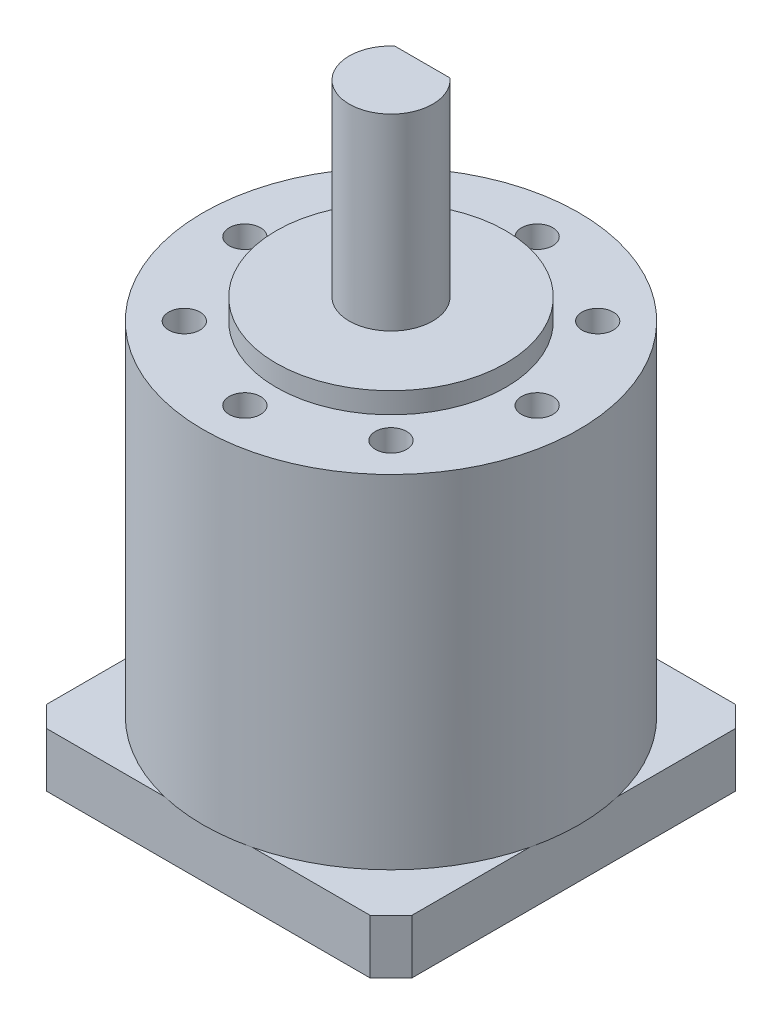
ISO-10303-21;
HEADER;
FILE_DESCRIPTION(('STEP AP214'),'2;1');
FILE_NAME('part.step','',(''),(''),'','','');
FILE_SCHEMA(('AUTOMOTIVE_DESIGN { 1 0 10303 214 1 1 1 1 }'));
ENDSEC;
DATA;
#1=APPLICATION_CONTEXT('core data for automotive mechanical design processes');
#2=APPLICATION_PROTOCOL_DEFINITION('international standard','automotive_design',2000,#1);
#3=PRODUCT_CONTEXT('',#1,'mechanical');
#4=PRODUCT('Part','Part','',(#3));
#5=PRODUCT_RELATED_PRODUCT_CATEGORY('part','',(#4));
#6=PRODUCT_DEFINITION_FORMATION('','',#4);
#7=PRODUCT_DEFINITION_CONTEXT('part definition',#1,'design');
#8=PRODUCT_DEFINITION('design','',#6,#7);
#9=PRODUCT_DEFINITION_SHAPE('','',#8);
#10=(LENGTH_UNIT() NAMED_UNIT(*) SI_UNIT(.MILLI.,.METRE.));
#11=(NAMED_UNIT(*) PLANE_ANGLE_UNIT() SI_UNIT($,.RADIAN.));
#12=(NAMED_UNIT(*) SI_UNIT($,.STERADIAN.) SOLID_ANGLE_UNIT());
#13=UNCERTAINTY_MEASURE_WITH_UNIT(LENGTH_MEASURE(1.E-05),#10,'distance_accuracy_value','');
#14=(GEOMETRIC_REPRESENTATION_CONTEXT(3) GLOBAL_UNCERTAINTY_ASSIGNED_CONTEXT((#13)) GLOBAL_UNIT_ASSIGNED_CONTEXT((#10,
#11,#12)) REPRESENTATION_CONTEXT('',''));
#15=CARTESIAN_POINT('',(0.,0.,0.));
#16=DIRECTION('',(0.,0.,1.));
#17=DIRECTION('',(1.,0.,0.));
#18=AXIS2_PLACEMENT_3D('',#15,#16,#17);
#19=CARTESIAN_POINT('',(0.,5.2,0.));
#20=DIRECTION('',(0.,1.,0.));
#21=DIRECTION('',(0.,0.,1.));
#22=AXIS2_PLACEMENT_3D('',#19,#20,#21);
#23=PLANE('',#22);
#24=DIRECTION('',(1.,0.,0.));
#25=VECTOR('',#24,1.);
#26=CARTESIAN_POINT('',(-17.5,5.2,17.5));
#27=LINE('',#26,#25);
#28=CARTESIAN_POINT('',(4.21307488658817,5.2,17.5));
#29=VERTEX_POINT('',#28);
#30=CARTESIAN_POINT('',(15.5,5.2,17.5));
#31=VERTEX_POINT('',#30);
#32=EDGE_CURVE('E204',#29,#31,#27,.T.);
#33=ORIENTED_EDGE('',*,*,#32,.T.);
#34=DIRECTION('',(-0.707106781186548,0.,0.707106781186547));
#35=VECTOR('',#34,1.);
#36=CARTESIAN_POINT('',(16.5,5.2,16.5));
#37=LINE('',#36,#35);
#38=CARTESIAN_POINT('',(17.5,5.2,15.5));
#39=VERTEX_POINT('',#38);
#40=EDGE_CURVE('E243',#31,#39,#37,.F.);
#41=ORIENTED_EDGE('',*,*,#40,.T.);
#42=DIRECTION('',(0.,0.,-1.));
#43=VECTOR('',#42,1.);
#44=CARTESIAN_POINT('',(17.5,5.2,-17.5));
#45=LINE('',#44,#43);
#46=CARTESIAN_POINT('',(17.5,5.2,4.21307488658818));
#47=VERTEX_POINT('',#46);
#48=EDGE_CURVE('E193',#39,#47,#45,.T.);
#49=ORIENTED_EDGE('',*,*,#48,.T.);
#50=CARTESIAN_POINT('',(0.,5.2,0.));
#51=DIRECTION('',(0.,1.,0.));
#52=DIRECTION('',(0.,0.,1.));
#53=AXIS2_PLACEMENT_3D('',#50,#51,#52);
#54=CIRCLE('',#53,18.);
#55=EDGE_CURVE('E190',#29,#47,#54,.T.);
#56=ORIENTED_EDGE('',*,*,#55,.F.);
#57=EDGE_LOOP('',(#33,#41,#49,#56));
#58=FACE_BOUND('',#57,.T.);
#59=ADVANCED_FACE('F50',(#58),#23,.T.);
#60=CARTESIAN_POINT('',(17.5,5.2,-4.21307488658819));
#61=VERTEX_POINT('',#60);
#62=CARTESIAN_POINT('',(17.5,5.2,-15.5));
#63=VERTEX_POINT('',#62);
#64=EDGE_CURVE('E197',#61,#63,#45,.T.);
#65=ORIENTED_EDGE('',*,*,#64,.T.);
#66=DIRECTION('',(0.707106781186546,0.,0.707106781186549));
#67=VECTOR('',#66,1.);
#68=CARTESIAN_POINT('',(16.5,5.2,-16.5));
#69=LINE('',#68,#67);
#70=CARTESIAN_POINT('',(15.5,5.2,-17.5));
#71=VERTEX_POINT('',#70);
#72=EDGE_CURVE('E236',#63,#71,#69,.F.);
#73=ORIENTED_EDGE('',*,*,#72,.T.);
#74=DIRECTION('',(-1.,0.,0.));
#75=VECTOR('',#74,1.);
#76=CARTESIAN_POINT('',(-17.5,5.2,-17.5));
#77=LINE('',#76,#75);
#78=CARTESIAN_POINT('',(4.21307488658817,5.2,-17.5));
#79=VERTEX_POINT('',#78);
#80=EDGE_CURVE('E196',#71,#79,#77,.T.);
#81=ORIENTED_EDGE('',*,*,#80,.T.);
#82=EDGE_CURVE('E181',#61,#79,#54,.T.);
#83=ORIENTED_EDGE('',*,*,#82,.F.);
#84=EDGE_LOOP('',(#65,#73,#81,#83));
#85=FACE_BOUND('',#84,.T.);
#86=ADVANCED_FACE('F332',(#85),#23,.T.);
#87=CARTESIAN_POINT('',(-4.21307488658817,5.2,-17.5));
#88=VERTEX_POINT('',#87);
#89=CARTESIAN_POINT('',(-15.5,5.2,-17.5));
#90=VERTEX_POINT('',#89);
#91=EDGE_CURVE('E194',#88,#90,#77,.T.);
#92=ORIENTED_EDGE('',*,*,#91,.T.);
#93=DIRECTION('',(0.707106781186548,0.,-0.707106781186548));
#94=VECTOR('',#93,1.);
#95=CARTESIAN_POINT('',(-16.5,5.2,-16.5));
#96=LINE('',#95,#94);
#97=CARTESIAN_POINT('',(-17.5,5.2,-15.5));
#98=VERTEX_POINT('',#97);
#99=EDGE_CURVE('E11',#90,#98,#96,.F.);
#100=ORIENTED_EDGE('',*,*,#99,.T.);
#101=DIRECTION('',(0.,0.,1.));
#102=VECTOR('',#101,1.);
#103=CARTESIAN_POINT('',(-17.5,5.2,-17.5));
#104=LINE('',#103,#102);
#105=CARTESIAN_POINT('',(-17.5,5.2,-4.21307488658815));
#106=VERTEX_POINT('',#105);
#107=EDGE_CURVE('E205',#98,#106,#104,.T.);
#108=ORIENTED_EDGE('',*,*,#107,.T.);
#109=EDGE_CURVE('E311',#88,#106,#54,.T.);
#110=ORIENTED_EDGE('',*,*,#109,.F.);
#111=EDGE_LOOP('',(#92,#100,#108,#110));
#112=FACE_BOUND('',#111,.T.);
#113=ADVANCED_FACE('F314',(#112),#23,.T.);
#114=CARTESIAN_POINT('',(17.5,5.2,-17.5));
#115=DIRECTION('',(-1.,0.,0.));
#116=DIRECTION('',(0.,0.,1.));
#117=AXIS2_PLACEMENT_3D('',#114,#115,#116);
#118=PLANE('',#117);
#119=DIRECTION('',(0.,0.,-1.));
#120=VECTOR('',#119,1.);
#121=CARTESIAN_POINT('',(17.5,0.,-17.5));
#122=LINE('',#121,#120);
#123=CARTESIAN_POINT('',(17.5,0.,15.5));
#124=VERTEX_POINT('',#123);
#125=CARTESIAN_POINT('',(17.5,0.,-15.5));
#126=VERTEX_POINT('',#125);
#127=EDGE_CURVE('E189',#124,#126,#122,.T.);
#128=ORIENTED_EDGE('',*,*,#127,.T.);
#129=DIRECTION('',(0.,1.,0.));
#130=VECTOR('',#129,1.);
#131=CARTESIAN_POINT('',(17.5,5.2,-15.5));
#132=LINE('',#131,#130);
#133=EDGE_CURVE('E237',#126,#63,#132,.T.);
#134=ORIENTED_EDGE('',*,*,#133,.T.);
#135=ORIENTED_EDGE('',*,*,#64,.F.);
#136=EDGE_CURVE('E198',#47,#61,#45,.T.);
#137=ORIENTED_EDGE('',*,*,#136,.F.);
#138=ORIENTED_EDGE('',*,*,#48,.F.);
#139=DIRECTION('',(0.,-1.,0.));
#140=VECTOR('',#139,1.);
#141=CARTESIAN_POINT('',(17.5,5.2,15.5));
#142=LINE('',#141,#140);
#143=EDGE_CURVE('E233',#39,#124,#142,.T.);
#144=ORIENTED_EDGE('',*,*,#143,.T.);
#145=EDGE_LOOP('',(#128,#134,#135,#137,#138,#144));
#146=FACE_BOUND('',#145,.T.);
#147=ADVANCED_FACE('F283',(#146),#118,.F.);
#148=CARTESIAN_POINT('',(-17.5,5.2,-17.5));
#149=DIRECTION('',(0.,0.,1.));
#150=DIRECTION('',(1.,0.,0.));
#151=AXIS2_PLACEMENT_3D('',#148,#149,#150);
#152=PLANE('',#151);
#153=ORIENTED_EDGE('',*,*,#80,.F.);
#154=DIRECTION('',(0.,-1.,0.));
#155=VECTOR('',#154,1.);
#156=CARTESIAN_POINT('',(15.5,5.2,-17.5));
#157=LINE('',#156,#155);
#158=CARTESIAN_POINT('',(15.5,0.,-17.5));
#159=VERTEX_POINT('',#158);
#160=EDGE_CURVE('E225',#71,#159,#157,.T.);
#161=ORIENTED_EDGE('',*,*,#160,.T.);
#162=DIRECTION('',(-1.,0.,0.));
#163=VECTOR('',#162,1.);
#164=CARTESIAN_POINT('',(-17.5,0.,-17.5));
#165=LINE('',#164,#163);
#166=CARTESIAN_POINT('',(-15.5,0.,-17.5));
#167=VERTEX_POINT('',#166);
#168=EDGE_CURVE('E211',#159,#167,#165,.T.);
#169=ORIENTED_EDGE('',*,*,#168,.T.);
#170=DIRECTION('',(0.,1.,0.));
#171=VECTOR('',#170,1.);
#172=CARTESIAN_POINT('',(-15.5,5.2,-17.5));
#173=LINE('',#172,#171);
#174=EDGE_CURVE('E219',#167,#90,#173,.T.);
#175=ORIENTED_EDGE('',*,*,#174,.T.);
#176=ORIENTED_EDGE('',*,*,#91,.F.);
#177=EDGE_CURVE('E203',#79,#88,#77,.T.);
#178=ORIENTED_EDGE('',*,*,#177,.F.);
#179=EDGE_LOOP('',(#153,#161,#169,#175,#176,#178));
#180=FACE_BOUND('',#179,.T.);
#181=ADVANCED_FACE('F274',(#180),#152,.F.);
#182=CARTESIAN_POINT('',(-17.5,5.2,-17.5));
#183=DIRECTION('',(1.,0.,0.));
#184=DIRECTION('',(0.,0.,-1.));
#185=AXIS2_PLACEMENT_3D('',#182,#183,#184);
#186=PLANE('',#185);
#187=DIRECTION('',(0.,0.,1.));
#188=VECTOR('',#187,1.);
#189=CARTESIAN_POINT('',(-17.5,0.,-17.5));
#190=LINE('',#189,#188);
#191=CARTESIAN_POINT('',(-17.5,0.,-15.5));
#192=VERTEX_POINT('',#191);
#193=CARTESIAN_POINT('',(-17.5,0.,15.5));
#194=VERTEX_POINT('',#193);
#195=EDGE_CURVE('E212',#192,#194,#190,.T.);
#196=ORIENTED_EDGE('',*,*,#195,.T.);
#197=DIRECTION('',(0.,1.,0.));
#198=VECTOR('',#197,1.);
#199=CARTESIAN_POINT('',(-17.5,5.2,15.5));
#200=LINE('',#199,#198);
#201=CARTESIAN_POINT('',(-17.5,5.2,15.5));
#202=VERTEX_POINT('',#201);
#203=EDGE_CURVE('E67',#194,#202,#200,.T.);
#204=ORIENTED_EDGE('',*,*,#203,.T.);
#205=CARTESIAN_POINT('',(-17.5,5.2,4.21307488658816));
#206=VERTEX_POINT('',#205);
#207=EDGE_CURVE('E199',#206,#202,#104,.T.);
#208=ORIENTED_EDGE('',*,*,#207,.F.);
#209=EDGE_CURVE('E202',#106,#206,#104,.T.);
#210=ORIENTED_EDGE('',*,*,#209,.F.);
#211=ORIENTED_EDGE('',*,*,#107,.F.);
#212=DIRECTION('',(0.,-1.,0.));
#213=VECTOR('',#212,1.);
#214=CARTESIAN_POINT('',(-17.5,5.2,-15.5));
#215=LINE('',#214,#213);
#216=EDGE_CURVE('E250',#98,#192,#215,.T.);
#217=ORIENTED_EDGE('',*,*,#216,.T.);
#218=EDGE_LOOP('',(#196,#204,#208,#210,#211,#217));
#219=FACE_BOUND('',#218,.T.);
#220=ADVANCED_FACE('F268',(#219),#186,.F.);
#221=CARTESIAN_POINT('',(-17.5,5.2,17.5));
#222=DIRECTION('',(0.,0.,-1.));
#223=DIRECTION('',(-1.,0.,0.));
#224=AXIS2_PLACEMENT_3D('',#221,#222,#223);
#225=PLANE('',#224);
#226=DIRECTION('',(1.,0.,0.));
#227=VECTOR('',#226,1.);
#228=CARTESIAN_POINT('',(-17.5,0.,17.5));
#229=LINE('',#228,#227);
#230=CARTESIAN_POINT('',(-15.5,0.,17.5));
#231=VERTEX_POINT('',#230);
#232=CARTESIAN_POINT('',(15.5,0.,17.5));
#233=VERTEX_POINT('',#232);
#234=EDGE_CURVE('E216',#231,#233,#229,.T.);
#235=ORIENTED_EDGE('',*,*,#234,.T.);
#236=DIRECTION('',(0.,1.,0.));
#237=VECTOR('',#236,1.);
#238=CARTESIAN_POINT('',(15.5,5.2,17.5));
#239=LINE('',#238,#237);
#240=EDGE_CURVE('E245',#233,#31,#239,.T.);
#241=ORIENTED_EDGE('',*,*,#240,.T.);
#242=ORIENTED_EDGE('',*,*,#32,.F.);
#243=CARTESIAN_POINT('',(-4.21307488658817,5.2,17.5));
#244=VERTEX_POINT('',#243);
#245=EDGE_CURVE('E208',#244,#29,#27,.T.);
#246=ORIENTED_EDGE('',*,*,#245,.F.);
#247=CARTESIAN_POINT('',(-15.5,5.2,17.5));
#248=VERTEX_POINT('',#247);
#249=EDGE_CURVE('E206',#248,#244,#27,.T.);
#250=ORIENTED_EDGE('',*,*,#249,.F.);
#251=DIRECTION('',(0.,-1.,0.));
#252=VECTOR('',#251,1.);
#253=CARTESIAN_POINT('',(-15.5,5.2,17.5));
#254=LINE('',#253,#252);
#255=EDGE_CURVE('E238',#248,#231,#254,.T.);
#256=ORIENTED_EDGE('',*,*,#255,.T.);
#257=EDGE_LOOP('',(#235,#241,#242,#246,#250,#256));
#258=FACE_BOUND('',#257,.T.);
#259=ADVANCED_FACE('F256',(#258),#225,.F.);
#260=ORIENTED_EDGE('',*,*,#207,.T.);
#261=DIRECTION('',(-0.707106781186548,0.,-0.707106781186548));
#262=VECTOR('',#261,1.);
#263=CARTESIAN_POINT('',(-16.5,5.2,16.5));
#264=LINE('',#263,#262);
#265=EDGE_CURVE('E57',#202,#248,#264,.F.);
#266=ORIENTED_EDGE('',*,*,#265,.T.);
#267=ORIENTED_EDGE('',*,*,#249,.T.);
#268=EDGE_CURVE('E195',#206,#244,#54,.T.);
#269=ORIENTED_EDGE('',*,*,#268,.F.);
#270=EDGE_LOOP('',(#260,#266,#267,#269));
#271=FACE_BOUND('',#270,.T.);
#272=ADVANCED_FACE('F251',(#271),#23,.T.);
#273=CARTESIAN_POINT('',(0.,0.,0.));
#274=DIRECTION('',(0.,1.,0.));
#275=DIRECTION('',(0.,0.,1.));
#276=AXIS2_PLACEMENT_3D('',#273,#274,#275);
#277=PLANE('',#276);
#278=ORIENTED_EDGE('',*,*,#168,.F.);
#279=DIRECTION('',(-0.707106781186546,0.,-0.707106781186549));
#280=VECTOR('',#279,1.);
#281=CARTESIAN_POINT('',(15.5,0.,-17.5));
#282=LINE('',#281,#280);
#283=EDGE_CURVE('E231',#159,#126,#282,.F.);
#284=ORIENTED_EDGE('',*,*,#283,.T.);
#285=ORIENTED_EDGE('',*,*,#127,.F.);
#286=DIRECTION('',(0.707106781186548,0.,-0.707106781186547));
#287=VECTOR('',#286,1.);
#288=CARTESIAN_POINT('',(17.5,0.,15.5));
#289=LINE('',#288,#287);
#290=EDGE_CURVE('E226',#124,#233,#289,.F.);
#291=ORIENTED_EDGE('',*,*,#290,.T.);
#292=ORIENTED_EDGE('',*,*,#234,.F.);
#293=DIRECTION('',(0.707106781186548,0.,0.707106781186548));
#294=VECTOR('',#293,1.);
#295=CARTESIAN_POINT('',(-15.5,0.,17.5));
#296=LINE('',#295,#294);
#297=EDGE_CURVE('E229',#231,#194,#296,.F.);
#298=ORIENTED_EDGE('',*,*,#297,.T.);
#299=ORIENTED_EDGE('',*,*,#195,.F.);
#300=DIRECTION('',(-0.707106781186548,0.,0.707106781186548));
#301=VECTOR('',#300,1.);
#302=CARTESIAN_POINT('',(-17.5,0.,-15.5));
#303=LINE('',#302,#301);
#304=EDGE_CURVE('E223',#192,#167,#303,.F.);
#305=ORIENTED_EDGE('',*,*,#304,.T.);
#306=EDGE_LOOP('',(#278,#284,#285,#291,#292,#298,#299,#305));
#307=FACE_BOUND('',#306,.T.);
#308=ADVANCED_FACE('F270',(#307),#277,.F.);
#309=CARTESIAN_POINT('',(0.,5.2,0.));
#310=DIRECTION('',(0.,1.,0.));
#311=DIRECTION('',(0.,0.,1.));
#312=AXIS2_PLACEMENT_3D('',#309,#310,#311);
#313=PLANE('',#312);
#314=EDGE_CURVE('E191',#47,#61,#54,.T.);
#315=ORIENTED_EDGE('',*,*,#314,.F.);
#316=ORIENTED_EDGE('',*,*,#136,.T.);
#317=EDGE_LOOP('',(#315,#316));
#318=FACE_BOUND('',#317,.T.);
#319=ADVANCED_FACE('F319',(#318),#313,.F.);
#320=EDGE_CURVE('E308',#79,#88,#54,.T.);
#321=ORIENTED_EDGE('',*,*,#320,.F.);
#322=ORIENTED_EDGE('',*,*,#177,.T.);
#323=EDGE_LOOP('',(#321,#322));
#324=FACE_BOUND('',#323,.T.);
#325=ADVANCED_FACE('F320',(#324),#313,.F.);
#326=EDGE_CURVE('E304',#106,#206,#54,.T.);
#327=ORIENTED_EDGE('',*,*,#326,.F.);
#328=ORIENTED_EDGE('',*,*,#209,.T.);
#329=EDGE_LOOP('',(#327,#328));
#330=FACE_BOUND('',#329,.T.);
#331=ADVANCED_FACE('F317',(#330),#313,.F.);
#332=EDGE_CURVE('E171',#244,#29,#54,.T.);
#333=ORIENTED_EDGE('',*,*,#332,.F.);
#334=ORIENTED_EDGE('',*,*,#245,.T.);
#335=EDGE_LOOP('',(#333,#334));
#336=FACE_BOUND('',#335,.T.);
#337=ADVANCED_FACE('F296',(#336),#313,.F.);
#338=CARTESIAN_POINT('',(0.,38.,0.));
#339=DIRECTION('',(0.,-1.,0.));
#340=DIRECTION('',(0.,0.,-1.));
#341=AXIS2_PLACEMENT_3D('',#338,#339,#340);
#342=CYLINDRICAL_SURFACE('',#341,18.);
#343=CARTESIAN_POINT('',(0.,38.,0.));
#344=DIRECTION('',(0.,1.,0.));
#345=DIRECTION('',(0.,0.,1.));
#346=AXIS2_PLACEMENT_3D('',#343,#344,#345);
#347=CIRCLE('',#346,18.);
#348=CARTESIAN_POINT('',(0.,38.,18.));
#349=VERTEX_POINT('',#348);
#350=EDGE_CURVE('E184',#349,#349,#347,.T.);
#351=ORIENTED_EDGE('',*,*,#350,.F.);
#352=EDGE_LOOP('',(#351));
#353=FACE_BOUND('',#352,.T.);
#354=ORIENTED_EDGE('',*,*,#55,.T.);
#355=ORIENTED_EDGE('',*,*,#314,.T.);
#356=ORIENTED_EDGE('',*,*,#82,.T.);
#357=ORIENTED_EDGE('',*,*,#320,.T.);
#358=ORIENTED_EDGE('',*,*,#109,.T.);
#359=ORIENTED_EDGE('',*,*,#326,.T.);
#360=ORIENTED_EDGE('',*,*,#268,.T.);
#361=ORIENTED_EDGE('',*,*,#332,.T.);
#362=EDGE_LOOP('',(#354,#355,#356,#357,#358,#359,#360,#361));
#363=FACE_BOUND('',#362,.T.);
#364=ADVANCED_FACE('F305',(#353,#363),#342,.T.);
#365=CARTESIAN_POINT('',(0.,38.,0.));
#366=DIRECTION('',(0.,1.,0.));
#367=DIRECTION('',(0.,0.,1.));
#368=AXIS2_PLACEMENT_3D('',#365,#366,#367);
#369=PLANE('',#368);
#370=CARTESIAN_POINT('',(-9.89949493661168,38.,9.89949493661165));
#371=DIRECTION('',(0.,1.,0.));
#372=DIRECTION('',(0.,0.,1.));
#373=AXIS2_PLACEMENT_3D('',#370,#371,#372);
#374=CIRCLE('',#373,1.5);
#375=CARTESIAN_POINT('',(-9.89949493661168,38.,11.3994949366117));
#376=VERTEX_POINT('',#375);
#377=EDGE_CURVE('E417',#376,#376,#374,.T.);
#378=ORIENTED_EDGE('',*,*,#377,.F.);
#379=EDGE_LOOP('',(#378));
#380=FACE_BOUND('',#379,.T.);
#381=CARTESIAN_POINT('',(9.89949493661165,38.,9.89949493661168));
#382=DIRECTION('',(0.,1.,0.));
#383=DIRECTION('',(0.,0.,1.));
#384=AXIS2_PLACEMENT_3D('',#381,#382,#383);
#385=CIRCLE('',#384,1.5);
#386=CARTESIAN_POINT('',(9.89949493661165,38.,11.3994949366117));
#387=VERTEX_POINT('',#386);
#388=EDGE_CURVE('E423',#387,#387,#385,.T.);
#389=ORIENTED_EDGE('',*,*,#388,.F.);
#390=EDGE_LOOP('',(#389));
#391=FACE_BOUND('',#390,.T.);
#392=CARTESIAN_POINT('',(9.89949493661168,38.,-9.89949493661165));
#393=DIRECTION('',(0.,1.,0.));
#394=DIRECTION('',(0.,0.,1.));
#395=AXIS2_PLACEMENT_3D('',#392,#393,#394);
#396=CIRCLE('',#395,1.5);
#397=CARTESIAN_POINT('',(9.89949493661168,38.,-8.39949493661165));
#398=VERTEX_POINT('',#397);
#399=EDGE_CURVE('E422',#398,#398,#396,.T.);
#400=ORIENTED_EDGE('',*,*,#399,.F.);
#401=EDGE_LOOP('',(#400));
#402=FACE_BOUND('',#401,.T.);
#403=CARTESIAN_POINT('',(-9.89949493661165,38.,-9.89949493661168));
#404=DIRECTION('',(0.,1.,0.));
#405=DIRECTION('',(0.,0.,1.));
#406=AXIS2_PLACEMENT_3D('',#403,#404,#405);
#407=CIRCLE('',#406,1.5);
#408=CARTESIAN_POINT('',(-9.89949493661165,38.,-8.39949493661168));
#409=VERTEX_POINT('',#408);
#410=EDGE_CURVE('E427',#409,#409,#407,.T.);
#411=ORIENTED_EDGE('',*,*,#410,.F.);
#412=EDGE_LOOP('',(#411));
#413=FACE_BOUND('',#412,.T.);
#414=CARTESIAN_POINT('',(0.,38.,-14.));
#415=DIRECTION('',(0.,1.,0.));
#416=DIRECTION('',(0.,0.,1.));
#417=AXIS2_PLACEMENT_3D('',#414,#415,#416);
#418=CIRCLE('',#417,1.5);
#419=CARTESIAN_POINT('',(0.,38.,-12.5));
#420=VERTEX_POINT('',#419);
#421=EDGE_CURVE('E433',#420,#420,#418,.T.);
#422=ORIENTED_EDGE('',*,*,#421,.F.);
#423=EDGE_LOOP('',(#422));
#424=FACE_BOUND('',#423,.T.);
#425=CARTESIAN_POINT('',(14.,38.,0.));
#426=DIRECTION('',(0.,1.,0.));
#427=DIRECTION('',(0.,0.,1.));
#428=AXIS2_PLACEMENT_3D('',#425,#426,#427);
#429=CIRCLE('',#428,1.5);
#430=CARTESIAN_POINT('',(14.,38.,1.50000000000005));
#431=VERTEX_POINT('',#430);
#432=EDGE_CURVE('E440',#431,#431,#429,.T.);
#433=ORIENTED_EDGE('',*,*,#432,.F.);
#434=EDGE_LOOP('',(#433));
#435=FACE_BOUND('',#434,.T.);
#436=CARTESIAN_POINT('',(0.,38.,14.));
#437=DIRECTION('',(0.,1.,0.));
#438=DIRECTION('',(0.,0.,1.));
#439=AXIS2_PLACEMENT_3D('',#436,#437,#438);
#440=CIRCLE('',#439,1.50000000000009);
#441=CARTESIAN_POINT('',(0.,38.,15.5000000000001));
#442=VERTEX_POINT('',#441);
#443=EDGE_CURVE('E442',#442,#442,#440,.T.);
#444=ORIENTED_EDGE('',*,*,#443,.F.);
#445=EDGE_LOOP('',(#444));
#446=FACE_BOUND('',#445,.T.);
#447=CARTESIAN_POINT('',(-14.,38.,0.));
#448=DIRECTION('',(0.,1.,0.));
#449=DIRECTION('',(0.,0.,1.));
#450=AXIS2_PLACEMENT_3D('',#447,#448,#449);
#451=CIRCLE('',#450,1.50000000000014);
#452=CARTESIAN_POINT('',(-14.,38.,1.50000000000015));
#453=VERTEX_POINT('',#452);
#454=EDGE_CURVE('E443',#453,#453,#451,.T.);
#455=ORIENTED_EDGE('',*,*,#454,.F.);
#456=EDGE_LOOP('',(#455));
#457=FACE_BOUND('',#456,.T.);
#458=CARTESIAN_POINT('',(0.,38.,0.));
#459=DIRECTION('',(0.,1.,0.));
#460=DIRECTION('',(0.,0.,1.));
#461=AXIS2_PLACEMENT_3D('',#458,#459,#460);
#462=CIRCLE('',#461,11.);
#463=CARTESIAN_POINT('',(0.,38.,11.));
#464=VERTEX_POINT('',#463);
#465=EDGE_CURVE('E177',#464,#464,#462,.T.);
#466=ORIENTED_EDGE('',*,*,#465,.F.);
#467=EDGE_LOOP('',(#466));
#468=FACE_BOUND('',#467,.T.);
#469=ORIENTED_EDGE('',*,*,#350,.T.);
#470=EDGE_LOOP('',(#469));
#471=FACE_BOUND('',#470,.T.);
#472=ADVANCED_FACE('F404',(#380,#391,#402,#413,#424,#435,#446,#457,#468,#471),#369,.T.);
#473=CARTESIAN_POINT('',(0.,40.,0.));
#474=DIRECTION('',(0.,-1.,0.));
#475=DIRECTION('',(0.,0.,-1.));
#476=AXIS2_PLACEMENT_3D('',#473,#474,#475);
#477=CYLINDRICAL_SURFACE('',#476,11.);
#478=CARTESIAN_POINT('',(0.,40.,0.));
#479=DIRECTION('',(0.,1.,0.));
#480=DIRECTION('',(0.,0.,1.));
#481=AXIS2_PLACEMENT_3D('',#478,#479,#480);
#482=CIRCLE('',#481,11.);
#483=CARTESIAN_POINT('',(0.,40.,11.));
#484=VERTEX_POINT('',#483);
#485=EDGE_CURVE('E172',#484,#484,#482,.T.);
#486=ORIENTED_EDGE('',*,*,#485,.F.);
#487=EDGE_LOOP('',(#486));
#488=FACE_BOUND('',#487,.T.);
#489=ORIENTED_EDGE('',*,*,#465,.T.);
#490=EDGE_LOOP('',(#489));
#491=FACE_BOUND('',#490,.T.);
#492=ADVANCED_FACE('F402',(#488,#491),#477,.T.);
#493=CARTESIAN_POINT('',(0.,40.,0.));
#494=DIRECTION('',(0.,1.,0.));
#495=DIRECTION('',(0.,0.,1.));
#496=AXIS2_PLACEMENT_3D('',#493,#494,#495);
#497=PLANE('',#496);
#498=CARTESIAN_POINT('',(0.,40.,0.));
#499=DIRECTION('',(0.,1.,0.));
#500=DIRECTION('',(0.,0.,1.));
#501=AXIS2_PLACEMENT_3D('',#498,#499,#500);
#502=CIRCLE('',#501,4.);
#503=CARTESIAN_POINT('',(0.,40.,4.));
#504=VERTEX_POINT('',#503);
#505=EDGE_CURVE('E161',#504,#504,#502,.T.);
#506=ORIENTED_EDGE('',*,*,#505,.F.);
#507=EDGE_LOOP('',(#506));
#508=FACE_BOUND('',#507,.T.);
#509=ORIENTED_EDGE('',*,*,#485,.T.);
#510=EDGE_LOOP('',(#509));
#511=FACE_BOUND('',#510,.T.);
#512=ADVANCED_FACE('F398',(#508,#511),#497,.T.);
#513=CARTESIAN_POINT('',(0.,58.,0.));
#514=DIRECTION('',(0.,-1.,0.));
#515=DIRECTION('',(0.,0.,-1.));
#516=AXIS2_PLACEMENT_3D('',#513,#514,#515);
#517=CYLINDRICAL_SURFACE('',#516,4.);
#518=CARTESIAN_POINT('',(0.,58.,0.));
#519=DIRECTION('',(0.,1.,0.));
#520=DIRECTION('',(0.,0.,1.));
#521=AXIS2_PLACEMENT_3D('',#518,#519,#520);
#522=CIRCLE('',#521,4.);
#523=CARTESIAN_POINT('',(-2.64575131106459,58.,-3.));
#524=VERTEX_POINT('',#523);
#525=CARTESIAN_POINT('',(2.64575131106459,58.,-3.));
#526=VERTEX_POINT('',#525);
#527=EDGE_CURVE('E170',#524,#526,#522,.T.);
#528=ORIENTED_EDGE('',*,*,#527,.F.);
#529=DIRECTION('',(0.,-1.,0.));
#530=VECTOR('',#529,1.);
#531=CARTESIAN_POINT('',(-2.64575131106459,58.,-3.));
#532=LINE('',#531,#530);
#533=CARTESIAN_POINT('',(-2.64575131106459,43.,-3.));
#534=VERTEX_POINT('',#533);
#535=EDGE_CURVE('E156',#524,#534,#532,.T.);
#536=ORIENTED_EDGE('',*,*,#535,.T.);
#537=CARTESIAN_POINT('',(0.,43.,0.));
#538=DIRECTION('',(0.,-1.,0.));
#539=DIRECTION('',(0.,0.,-1.));
#540=AXIS2_PLACEMENT_3D('',#537,#538,#539);
#541=CIRCLE('',#540,4.);
#542=CARTESIAN_POINT('',(2.64575131106459,43.,-3.));
#543=VERTEX_POINT('',#542);
#544=EDGE_CURVE('E159',#534,#543,#541,.T.);
#545=ORIENTED_EDGE('',*,*,#544,.T.);
#546=DIRECTION('',(0.,-1.,0.));
#547=VECTOR('',#546,1.);
#548=CARTESIAN_POINT('',(2.64575131106459,58.,-3.));
#549=LINE('',#548,#547);
#550=EDGE_CURVE('E153',#543,#526,#549,.F.);
#551=ORIENTED_EDGE('',*,*,#550,.T.);
#552=EDGE_LOOP('',(#528,#536,#545,#551));
#553=FACE_BOUND('',#552,.T.);
#554=ORIENTED_EDGE('',*,*,#505,.T.);
#555=EDGE_LOOP('',(#554));
#556=FACE_BOUND('',#555,.T.);
#557=ADVANCED_FACE('F164',(#553,#556),#517,.T.);
#558=CARTESIAN_POINT('',(0.,58.,0.));
#559=DIRECTION('',(0.,1.,0.));
#560=DIRECTION('',(0.,0.,1.));
#561=AXIS2_PLACEMENT_3D('',#558,#559,#560);
#562=PLANE('',#561);
#563=DIRECTION('',(1.,0.,0.));
#564=VECTOR('',#563,1.);
#565=CARTESIAN_POINT('',(0.,58.,-3.));
#566=LINE('',#565,#564);
#567=EDGE_CURVE('E149',#524,#526,#566,.T.);
#568=ORIENTED_EDGE('',*,*,#567,.F.);
#569=ORIENTED_EDGE('',*,*,#527,.T.);
#570=EDGE_LOOP('',(#568,#569));
#571=FACE_BOUND('',#570,.T.);
#572=ADVANCED_FACE('F168',(#571),#562,.T.);
#573=CARTESIAN_POINT('',(0.,43.,0.));
#574=DIRECTION('',(0.,-1.,0.));
#575=DIRECTION('',(0.,0.,-1.));
#576=AXIS2_PLACEMENT_3D('',#573,#574,#575);
#577=PLANE('',#576);
#578=DIRECTION('',(1.,0.,0.));
#579=VECTOR('',#578,1.);
#580=CARTESIAN_POINT('',(5.27340823970037,43.,-3.));
#581=LINE('',#580,#579);
#582=EDGE_CURVE('E169',#534,#543,#581,.T.);
#583=ORIENTED_EDGE('',*,*,#582,.T.);
#584=ORIENTED_EDGE('',*,*,#544,.F.);
#585=EDGE_LOOP('',(#583,#584));
#586=FACE_BOUND('',#585,.T.);
#587=ADVANCED_FACE('F386',(#586),#577,.F.);
#588=CARTESIAN_POINT('',(5.27340823970037,43.,-3.));
#589=DIRECTION('',(0.,0.,1.));
#590=DIRECTION('',(1.,0.,0.));
#591=AXIS2_PLACEMENT_3D('',#588,#589,#590);
#592=PLANE('',#591);
#593=ORIENTED_EDGE('',*,*,#567,.T.);
#594=ORIENTED_EDGE('',*,*,#550,.F.);
#595=ORIENTED_EDGE('',*,*,#582,.F.);
#596=ORIENTED_EDGE('',*,*,#535,.F.);
#597=EDGE_LOOP('',(#593,#594,#595,#596));
#598=FACE_BOUND('',#597,.T.);
#599=ADVANCED_FACE('F151',(#598),#592,.F.);
#600=CARTESIAN_POINT('',(15.5,5.2,-17.5));
#601=DIRECTION('',(-0.707106781186549,0.,0.707106781186546));
#602=DIRECTION('',(0.,-1.,0.));
#603=AXIS2_PLACEMENT_3D('',#600,#601,#602);
#604=PLANE('',#603);
#605=ORIENTED_EDGE('',*,*,#72,.F.);
#606=ORIENTED_EDGE('',*,*,#133,.F.);
#607=ORIENTED_EDGE('',*,*,#283,.F.);
#608=ORIENTED_EDGE('',*,*,#160,.F.);
#609=EDGE_LOOP('',(#605,#606,#607,#608));
#610=FACE_BOUND('',#609,.T.);
#611=ADVANCED_FACE('F282',(#610),#604,.F.);
#612=CARTESIAN_POINT('',(17.5,5.2,15.5));
#613=DIRECTION('',(-0.707106781186547,0.,-0.707106781186548));
#614=DIRECTION('',(0.,-1.,0.));
#615=AXIS2_PLACEMENT_3D('',#612,#613,#614);
#616=PLANE('',#615);
#617=ORIENTED_EDGE('',*,*,#40,.F.);
#618=ORIENTED_EDGE('',*,*,#240,.F.);
#619=ORIENTED_EDGE('',*,*,#290,.F.);
#620=ORIENTED_EDGE('',*,*,#143,.F.);
#621=EDGE_LOOP('',(#617,#618,#619,#620));
#622=FACE_BOUND('',#621,.T.);
#623=ADVANCED_FACE('F291',(#622),#616,.F.);
#624=CARTESIAN_POINT('',(-15.5,5.2,17.5));
#625=DIRECTION('',(0.707106781186547,0.,-0.707106781186547));
#626=DIRECTION('',(0.,-1.,0.));
#627=AXIS2_PLACEMENT_3D('',#624,#625,#626);
#628=PLANE('',#627);
#629=ORIENTED_EDGE('',*,*,#265,.F.);
#630=ORIENTED_EDGE('',*,*,#203,.F.);
#631=ORIENTED_EDGE('',*,*,#297,.F.);
#632=ORIENTED_EDGE('',*,*,#255,.F.);
#633=EDGE_LOOP('',(#629,#630,#631,#632));
#634=FACE_BOUND('',#633,.T.);
#635=ADVANCED_FACE('F263',(#634),#628,.F.);
#636=CARTESIAN_POINT('',(-17.5,5.2,-15.5));
#637=DIRECTION('',(0.707106781186547,0.,0.707106781186547));
#638=DIRECTION('',(0.,-1.,0.));
#639=AXIS2_PLACEMENT_3D('',#636,#637,#638);
#640=PLANE('',#639);
#641=ORIENTED_EDGE('',*,*,#99,.F.);
#642=ORIENTED_EDGE('',*,*,#174,.F.);
#643=ORIENTED_EDGE('',*,*,#304,.F.);
#644=ORIENTED_EDGE('',*,*,#216,.F.);
#645=EDGE_LOOP('',(#641,#642,#643,#644));
#646=FACE_BOUND('',#645,.T.);
#647=ADVANCED_FACE('F49',(#646),#640,.F.);
#648=CARTESIAN_POINT('',(-14.,32.,0.));
#649=DIRECTION('',(0.,1.,0.));
#650=DIRECTION('',(0.,0.,1.));
#651=AXIS2_PLACEMENT_3D('',#648,#649,#650);
#652=CYLINDRICAL_SURFACE('',#651,1.50000000000014);
#653=CARTESIAN_POINT('',(-14.,32.,0.));
#654=DIRECTION('',(0.,1.,0.));
#655=DIRECTION('',(0.,0.,1.));
#656=AXIS2_PLACEMENT_3D('',#653,#654,#655);
#657=CIRCLE('',#656,1.50000000000014);
#658=CARTESIAN_POINT('',(-14.,32.,1.50000000000015));
#659=VERTEX_POINT('',#658);
#660=EDGE_CURVE('E448',#659,#659,#657,.T.);
#661=ORIENTED_EDGE('',*,*,#660,.F.);
#662=EDGE_LOOP('',(#661));
#663=FACE_BOUND('',#662,.T.);
#664=ORIENTED_EDGE('',*,*,#454,.T.);
#665=EDGE_LOOP('',(#664));
#666=FACE_BOUND('',#665,.T.);
#667=ADVANCED_FACE('F375',(#663,#666),#652,.F.);
#668=CARTESIAN_POINT('',(-14.,32.,0.));
#669=DIRECTION('',(0.,1.,0.));
#670=DIRECTION('',(0.,0.,1.));
#671=AXIS2_PLACEMENT_3D('',#668,#669,#670);
#672=PLANE('',#671);
#673=ORIENTED_EDGE('',*,*,#660,.T.);
#674=EDGE_LOOP('',(#673));
#675=FACE_BOUND('',#674,.T.);
#676=ADVANCED_FACE('F376',(#675),#672,.T.);
#677=CARTESIAN_POINT('',(0.,32.,14.));
#678=DIRECTION('',(0.,1.,0.));
#679=DIRECTION('',(0.,0.,1.));
#680=AXIS2_PLACEMENT_3D('',#677,#678,#679);
#681=CYLINDRICAL_SURFACE('',#680,1.50000000000009);
#682=CARTESIAN_POINT('',(0.,32.,14.));
#683=DIRECTION('',(0.,1.,0.));
#684=DIRECTION('',(0.,0.,1.));
#685=AXIS2_PLACEMENT_3D('',#682,#683,#684);
#686=CIRCLE('',#685,1.50000000000009);
#687=CARTESIAN_POINT('',(0.,32.,15.5000000000001));
#688=VERTEX_POINT('',#687);
#689=EDGE_CURVE('E473',#688,#688,#686,.T.);
#690=ORIENTED_EDGE('',*,*,#689,.F.);
#691=EDGE_LOOP('',(#690));
#692=FACE_BOUND('',#691,.T.);
#693=ORIENTED_EDGE('',*,*,#443,.T.);
#694=EDGE_LOOP('',(#693));
#695=FACE_BOUND('',#694,.T.);
#696=ADVANCED_FACE('F385',(#692,#695),#681,.F.);
#697=CARTESIAN_POINT('',(0.,32.,14.));
#698=DIRECTION('',(0.,1.,0.));
#699=DIRECTION('',(0.,0.,1.));
#700=AXIS2_PLACEMENT_3D('',#697,#698,#699);
#701=PLANE('',#700);
#702=ORIENTED_EDGE('',*,*,#689,.T.);
#703=EDGE_LOOP('',(#702));
#704=FACE_BOUND('',#703,.T.);
#705=ADVANCED_FACE('F474',(#704),#701,.T.);
#706=CARTESIAN_POINT('',(14.,32.,0.));
#707=DIRECTION('',(0.,1.,0.));
#708=DIRECTION('',(0.,0.,1.));
#709=AXIS2_PLACEMENT_3D('',#706,#707,#708);
#710=CYLINDRICAL_SURFACE('',#709,1.5);
#711=CARTESIAN_POINT('',(14.,32.,0.));
#712=DIRECTION('',(0.,1.,0.));
#713=DIRECTION('',(0.,0.,1.));
#714=AXIS2_PLACEMENT_3D('',#711,#712,#713);
#715=CIRCLE('',#714,1.5);
#716=CARTESIAN_POINT('',(14.,32.,1.50000000000005));
#717=VERTEX_POINT('',#716);
#718=EDGE_CURVE('E461',#717,#717,#715,.T.);
#719=ORIENTED_EDGE('',*,*,#718,.F.);
#720=EDGE_LOOP('',(#719));
#721=FACE_BOUND('',#720,.T.);
#722=ORIENTED_EDGE('',*,*,#432,.T.);
#723=EDGE_LOOP('',(#722));
#724=FACE_BOUND('',#723,.T.);
#725=ADVANCED_FACE('F477',(#721,#724),#710,.F.);
#726=CARTESIAN_POINT('',(14.,32.,0.));
#727=DIRECTION('',(0.,1.,0.));
#728=DIRECTION('',(0.,0.,1.));
#729=AXIS2_PLACEMENT_3D('',#726,#727,#728);
#730=PLANE('',#729);
#731=ORIENTED_EDGE('',*,*,#718,.T.);
#732=EDGE_LOOP('',(#731));
#733=FACE_BOUND('',#732,.T.);
#734=ADVANCED_FACE('F490',(#733),#730,.T.);
#735=CARTESIAN_POINT('',(0.,32.,-14.));
#736=DIRECTION('',(0.,1.,0.));
#737=DIRECTION('',(0.,0.,1.));
#738=AXIS2_PLACEMENT_3D('',#735,#736,#737);
#739=CYLINDRICAL_SURFACE('',#738,1.5);
#740=CARTESIAN_POINT('',(0.,32.,-14.));
#741=DIRECTION('',(0.,1.,0.));
#742=DIRECTION('',(0.,0.,1.));
#743=AXIS2_PLACEMENT_3D('',#740,#741,#742);
#744=CIRCLE('',#743,1.5);
#745=CARTESIAN_POINT('',(0.,32.,-12.5));
#746=VERTEX_POINT('',#745);
#747=EDGE_CURVE('E459',#746,#746,#744,.T.);
#748=ORIENTED_EDGE('',*,*,#747,.F.);
#749=EDGE_LOOP('',(#748));
#750=FACE_BOUND('',#749,.T.);
#751=ORIENTED_EDGE('',*,*,#421,.T.);
#752=EDGE_LOOP('',(#751));
#753=FACE_BOUND('',#752,.T.);
#754=ADVANCED_FACE('F491',(#750,#753),#739,.F.);
#755=CARTESIAN_POINT('',(0.,32.,-14.));
#756=DIRECTION('',(0.,1.,0.));
#757=DIRECTION('',(0.,0.,1.));
#758=AXIS2_PLACEMENT_3D('',#755,#756,#757);
#759=PLANE('',#758);
#760=ORIENTED_EDGE('',*,*,#747,.T.);
#761=EDGE_LOOP('',(#760));
#762=FACE_BOUND('',#761,.T.);
#763=ADVANCED_FACE('F494',(#762),#759,.T.);
#764=CARTESIAN_POINT('',(-9.89949493661165,32.,-9.89949493661168));
#765=DIRECTION('',(0.,1.,0.));
#766=DIRECTION('',(0.,0.,1.));
#767=AXIS2_PLACEMENT_3D('',#764,#765,#766);
#768=CYLINDRICAL_SURFACE('',#767,1.5);
#769=CARTESIAN_POINT('',(-9.89949493661165,32.,-9.89949493661168));
#770=DIRECTION('',(0.,1.,0.));
#771=DIRECTION('',(0.,0.,1.));
#772=AXIS2_PLACEMENT_3D('',#769,#770,#771);
#773=CIRCLE('',#772,1.5);
#774=CARTESIAN_POINT('',(-9.89949493661165,32.,-8.39949493661168));
#775=VERTEX_POINT('',#774);
#776=EDGE_CURVE('E451',#775,#775,#773,.T.);
#777=ORIENTED_EDGE('',*,*,#776,.F.);
#778=EDGE_LOOP('',(#777));
#779=FACE_BOUND('',#778,.T.);
#780=ORIENTED_EDGE('',*,*,#410,.T.);
#781=EDGE_LOOP('',(#780));
#782=FACE_BOUND('',#781,.T.);
#783=ADVANCED_FACE('F499',(#779,#782),#768,.F.);
#784=CARTESIAN_POINT('',(-9.89949493661165,32.,-9.89949493661168));
#785=DIRECTION('',(0.,1.,0.));
#786=DIRECTION('',(0.,0.,1.));
#787=AXIS2_PLACEMENT_3D('',#784,#785,#786);
#788=PLANE('',#787);
#789=ORIENTED_EDGE('',*,*,#776,.T.);
#790=EDGE_LOOP('',(#789));
#791=FACE_BOUND('',#790,.T.);
#792=ADVANCED_FACE('F498',(#791),#788,.T.);
#793=CARTESIAN_POINT('',(9.89949493661168,32.,-9.89949493661165));
#794=DIRECTION('',(0.,1.,0.));
#795=DIRECTION('',(0.,0.,1.));
#796=AXIS2_PLACEMENT_3D('',#793,#794,#795);
#797=CYLINDRICAL_SURFACE('',#796,1.5);
#798=CARTESIAN_POINT('',(9.89949493661168,32.,-9.89949493661165));
#799=DIRECTION('',(0.,1.,0.));
#800=DIRECTION('',(0.,0.,1.));
#801=AXIS2_PLACEMENT_3D('',#798,#799,#800);
#802=CIRCLE('',#801,1.5);
#803=CARTESIAN_POINT('',(9.89949493661168,32.,-8.39949493661165));
#804=VERTEX_POINT('',#803);
#805=EDGE_CURVE('E535',#804,#804,#802,.T.);
#806=ORIENTED_EDGE('',*,*,#805,.F.);
#807=EDGE_LOOP('',(#806));
#808=FACE_BOUND('',#807,.T.);
#809=ORIENTED_EDGE('',*,*,#399,.T.);
#810=EDGE_LOOP('',(#809));
#811=FACE_BOUND('',#810,.T.);
#812=ADVANCED_FACE('F501',(#808,#811),#797,.F.);
#813=CARTESIAN_POINT('',(9.89949493661168,32.,-9.89949493661165));
#814=DIRECTION('',(0.,1.,0.));
#815=DIRECTION('',(0.,0.,1.));
#816=AXIS2_PLACEMENT_3D('',#813,#814,#815);
#817=PLANE('',#816);
#818=ORIENTED_EDGE('',*,*,#805,.T.);
#819=EDGE_LOOP('',(#818));
#820=FACE_BOUND('',#819,.T.);
#821=ADVANCED_FACE('F520',(#820),#817,.T.);
#822=CARTESIAN_POINT('',(9.89949493661165,32.,9.89949493661168));
#823=DIRECTION('',(0.,1.,0.));
#824=DIRECTION('',(0.,0.,1.));
#825=AXIS2_PLACEMENT_3D('',#822,#823,#824);
#826=CYLINDRICAL_SURFACE('',#825,1.5);
#827=CARTESIAN_POINT('',(9.89949493661165,32.,9.89949493661168));
#828=DIRECTION('',(0.,1.,0.));
#829=DIRECTION('',(0.,0.,1.));
#830=AXIS2_PLACEMENT_3D('',#827,#828,#829);
#831=CIRCLE('',#830,1.5);
#832=CARTESIAN_POINT('',(9.89949493661165,32.,11.3994949366117));
#833=VERTEX_POINT('',#832);
#834=EDGE_CURVE('E534',#833,#833,#831,.T.);
#835=ORIENTED_EDGE('',*,*,#834,.F.);
#836=EDGE_LOOP('',(#835));
#837=FACE_BOUND('',#836,.T.);
#838=ORIENTED_EDGE('',*,*,#388,.T.);
#839=EDGE_LOOP('',(#838));
#840=FACE_BOUND('',#839,.T.);
#841=ADVANCED_FACE('F513',(#837,#840),#826,.F.);
#842=CARTESIAN_POINT('',(9.89949493661165,32.,9.89949493661168));
#843=DIRECTION('',(0.,1.,0.));
#844=DIRECTION('',(0.,0.,1.));
#845=AXIS2_PLACEMENT_3D('',#842,#843,#844);
#846=PLANE('',#845);
#847=ORIENTED_EDGE('',*,*,#834,.T.);
#848=EDGE_LOOP('',(#847));
#849=FACE_BOUND('',#848,.T.);
#850=ADVANCED_FACE('F509',(#849),#846,.T.);
#851=CARTESIAN_POINT('',(-9.89949493661168,32.,9.89949493661165));
#852=DIRECTION('',(0.,1.,0.));
#853=DIRECTION('',(0.,0.,1.));
#854=AXIS2_PLACEMENT_3D('',#851,#852,#853);
#855=CYLINDRICAL_SURFACE('',#854,1.5);
#856=CARTESIAN_POINT('',(-9.89949493661168,32.,9.89949493661165));
#857=DIRECTION('',(0.,1.,0.));
#858=DIRECTION('',(0.,0.,1.));
#859=AXIS2_PLACEMENT_3D('',#856,#857,#858);
#860=CIRCLE('',#859,1.5);
#861=CARTESIAN_POINT('',(-9.89949493661168,32.,11.3994949366117));
#862=VERTEX_POINT('',#861);
#863=EDGE_CURVE('E539',#862,#862,#860,.T.);
#864=ORIENTED_EDGE('',*,*,#863,.F.);
#865=EDGE_LOOP('',(#864));
#866=FACE_BOUND('',#865,.T.);
#867=ORIENTED_EDGE('',*,*,#377,.T.);
#868=EDGE_LOOP('',(#867));
#869=FACE_BOUND('',#868,.T.);
#870=ADVANCED_FACE('F506',(#866,#869),#855,.F.);
#871=CARTESIAN_POINT('',(-9.89949493661168,32.,9.89949493661165));
#872=DIRECTION('',(0.,1.,0.));
#873=DIRECTION('',(0.,0.,1.));
#874=AXIS2_PLACEMENT_3D('',#871,#872,#873);
#875=PLANE('',#874);
#876=ORIENTED_EDGE('',*,*,#863,.T.);
#877=EDGE_LOOP('',(#876));
#878=FACE_BOUND('',#877,.T.);
#879=ADVANCED_FACE('F507',(#878),#875,.T.);
#880=CLOSED_SHELL('',(#59,#86,#113,#147,#181,#220,#259,#272,#308,#319,#325,#331,#337,#364,#472,
#492,#512,#557,#572,#587,#599,#611,#623,#635,#647,#667,#676,#696,#705,#725,#734,#754,#763,#783,
#792,#812,#821,#841,#850,#870,#879));
#881=MANIFOLD_SOLID_BREP('B2',#880);
#882=ADVANCED_BREP_SHAPE_REPRESENTATION('',(#18,#881),#14);
#883=SHAPE_DEFINITION_REPRESENTATION(#9,#882);
ENDSEC;
END-ISO-10303-21;
